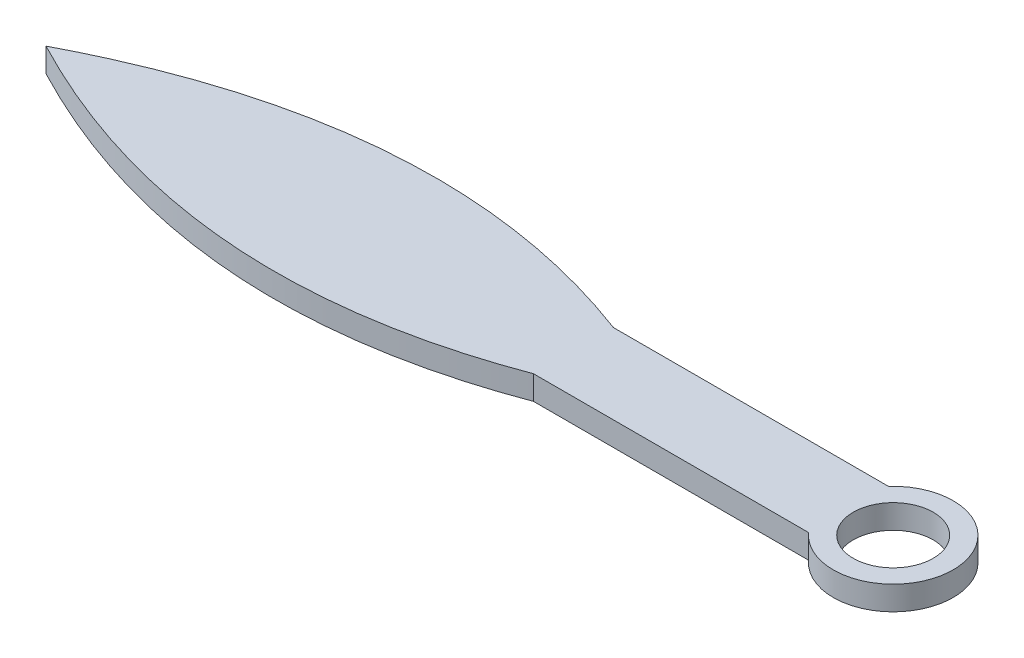
ISO-10303-21;
HEADER;
FILE_DESCRIPTION(('STEP AP214'),'2;1');
FILE_NAME('part.step','',(''),(''),'','','');
FILE_SCHEMA(('AUTOMOTIVE_DESIGN { 1 0 10303 214 1 1 1 1 }'));
ENDSEC;
DATA;
#1=APPLICATION_CONTEXT('core data for automotive mechanical design processes');
#2=APPLICATION_PROTOCOL_DEFINITION('international standard','automotive_design',2000,#1);
#3=PRODUCT_CONTEXT('',#1,'mechanical');
#4=PRODUCT('Part','Part','',(#3));
#5=PRODUCT_RELATED_PRODUCT_CATEGORY('part','',(#4));
#6=PRODUCT_DEFINITION_FORMATION('','',#4);
#7=PRODUCT_DEFINITION_CONTEXT('part definition',#1,'design');
#8=PRODUCT_DEFINITION('design','',#6,#7);
#9=PRODUCT_DEFINITION_SHAPE('','',#8);
#10=(LENGTH_UNIT() NAMED_UNIT(*) SI_UNIT(.MILLI.,.METRE.));
#11=(NAMED_UNIT(*) PLANE_ANGLE_UNIT() SI_UNIT($,.RADIAN.));
#12=(NAMED_UNIT(*) SI_UNIT($,.STERADIAN.) SOLID_ANGLE_UNIT());
#13=UNCERTAINTY_MEASURE_WITH_UNIT(LENGTH_MEASURE(1.E-05),#10,'distance_accuracy_value','');
#14=(GEOMETRIC_REPRESENTATION_CONTEXT(3) GLOBAL_UNCERTAINTY_ASSIGNED_CONTEXT((#13)) GLOBAL_UNIT_ASSIGNED_CONTEXT((#10,
#11,#12)) REPRESENTATION_CONTEXT('',''));
#15=CARTESIAN_POINT('',(0.,0.,0.));
#16=DIRECTION('',(0.,0.,1.));
#17=DIRECTION('',(1.,0.,0.));
#18=AXIS2_PLACEMENT_3D('',#15,#16,#17);
#19=CARTESIAN_POINT('',(-185.137744303975,7.62,25.1823706182628));
#20=DIRECTION('',(0.,1.,0.));
#21=DIRECTION('',(0.,0.,1.));
#22=AXIS2_PLACEMENT_3D('',#19,#20,#21);
#23=PLANE('',#22);
#24=CARTESIAN_POINT('',(-269.184277242038,7.62,0.));
#25=CARTESIAN_POINT('',(-184.88334998693,7.62,44.0147412365257));
#26=CARTESIAN_POINT('',(-101.6,7.62,12.7));
#27=B_SPLINE_CURVE_WITH_KNOTS('',2,(#24,#25,#26),.UNSPECIFIED.,.F.,.F.,(3,3),(0.,1.),.UNSPECIFIED.);
#28=CARTESIAN_POINT('',(-269.184277242038,7.62,0.));
#29=VERTEX_POINT('',#28);
#30=CARTESIAN_POINT('',(-101.6,7.62,12.7));
#31=VERTEX_POINT('',#30);
#32=EDGE_CURVE('E169',#29,#31,#27,.T.);
#33=ORIENTED_EDGE('',*,*,#32,.T.);
#34=DIRECTION('',(1.,0.,0.));
#35=VECTOR('',#34,1.);
#36=CARTESIAN_POINT('',(-14.1990316571237,7.62,12.7));
#37=LINE('',#36,#35);
#38=CARTESIAN_POINT('',(-14.1990316571237,7.62,12.7));
#39=VERTEX_POINT('',#38);
#40=EDGE_CURVE('E92',#31,#39,#37,.T.);
#41=ORIENTED_EDGE('',*,*,#40,.T.);
#42=CARTESIAN_POINT('',(0.,7.62,0.));
#43=DIRECTION('',(0.,1.,0.));
#44=DIRECTION('',(0.,0.,1.));
#45=AXIS2_PLACEMENT_3D('',#42,#43,#44);
#46=CIRCLE('',#45,19.05);
#47=CARTESIAN_POINT('',(-14.1990316571237,7.62,-12.7));
#48=VERTEX_POINT('',#47);
#49=EDGE_CURVE('E96',#39,#48,#46,.T.);
#50=ORIENTED_EDGE('',*,*,#49,.T.);
#51=DIRECTION('',(-1.,0.,0.));
#52=VECTOR('',#51,1.);
#53=CARTESIAN_POINT('',(-14.1990316571237,7.62,-12.7));
#54=LINE('',#53,#52);
#55=CARTESIAN_POINT('',(-101.6,7.62,-12.7));
#56=VERTEX_POINT('',#55);
#57=EDGE_CURVE('E100',#48,#56,#54,.T.);
#58=ORIENTED_EDGE('',*,*,#57,.T.);
#59=CARTESIAN_POINT('',(-101.6,7.62,-12.7));
#60=CARTESIAN_POINT('',(-184.88334998693,7.62,-44.0147412365256));
#61=CARTESIAN_POINT('',(-269.184277242038,7.62,0.));
#62=B_SPLINE_CURVE_WITH_KNOTS('',2,(#59,#60,#61),.UNSPECIFIED.,.F.,.F.,(3,3),(0.,1.),.UNSPECIFIED.);
#63=EDGE_CURVE('E58',#56,#29,#62,.T.);
#64=ORIENTED_EDGE('',*,*,#63,.T.);
#65=EDGE_LOOP('',(#33,#41,#50,#58,#64));
#66=FACE_BOUND('',#65,.T.);
#67=CARTESIAN_POINT('',(0.,7.62,0.));
#68=DIRECTION('',(0.,1.,0.));
#69=DIRECTION('',(0.,0.,1.));
#70=AXIS2_PLACEMENT_3D('',#67,#68,#69);
#71=CIRCLE('',#70,12.7);
#72=CARTESIAN_POINT('',(0.,7.62,-12.7));
#73=VERTEX_POINT('',#72);
#74=EDGE_CURVE('E160',#73,#73,#71,.T.);
#75=ORIENTED_EDGE('',*,*,#74,.F.);
#76=EDGE_LOOP('',(#75));
#77=FACE_BOUND('',#76,.T.);
#78=ADVANCED_FACE('F39',(#66,#77),#23,.T.);
#79=CARTESIAN_POINT('',(-185.137744303975,0.,25.1823706182628));
#80=DIRECTION('',(0.,1.,0.));
#81=DIRECTION('',(0.,0.,1.));
#82=AXIS2_PLACEMENT_3D('',#79,#80,#81);
#83=PLANE('',#82);
#84=CARTESIAN_POINT('',(-269.184277242038,0.,0.));
#85=CARTESIAN_POINT('',(-184.88334998693,0.,44.0147412365257));
#86=CARTESIAN_POINT('',(-101.6,0.,12.7));
#87=B_SPLINE_CURVE_WITH_KNOTS('',2,(#84,#85,#86),.UNSPECIFIED.,.F.,.F.,(3,3),(0.,1.),.UNSPECIFIED.);
#88=CARTESIAN_POINT('',(-269.184277242038,0.,0.));
#89=VERTEX_POINT('',#88);
#90=CARTESIAN_POINT('',(-101.6,0.,12.7));
#91=VERTEX_POINT('',#90);
#92=EDGE_CURVE('E123',#89,#91,#87,.T.);
#93=ORIENTED_EDGE('',*,*,#92,.F.);
#94=CARTESIAN_POINT('',(-101.6,0.,-12.7));
#95=CARTESIAN_POINT('',(-184.88334998693,0.,-44.0147412365256));
#96=CARTESIAN_POINT('',(-269.184277242038,0.,0.));
#97=B_SPLINE_CURVE_WITH_KNOTS('',2,(#94,#95,#96),.UNSPECIFIED.,.F.,.F.,(3,3),(0.,1.),.UNSPECIFIED.);
#98=CARTESIAN_POINT('',(-101.6,0.,-12.7));
#99=VERTEX_POINT('',#98);
#100=EDGE_CURVE('E84',#99,#89,#97,.T.);
#101=ORIENTED_EDGE('',*,*,#100,.F.);
#102=DIRECTION('',(-1.,0.,0.));
#103=VECTOR('',#102,1.);
#104=CARTESIAN_POINT('',(-14.1990316571237,0.,-12.7));
#105=LINE('',#104,#103);
#106=CARTESIAN_POINT('',(-14.1990316571237,0.,-12.7));
#107=VERTEX_POINT('',#106);
#108=EDGE_CURVE('E78',#107,#99,#105,.T.);
#109=ORIENTED_EDGE('',*,*,#108,.F.);
#110=CARTESIAN_POINT('',(0.,0.,0.));
#111=DIRECTION('',(0.,1.,0.));
#112=DIRECTION('',(0.,0.,1.));
#113=AXIS2_PLACEMENT_3D('',#110,#111,#112);
#114=CIRCLE('',#113,19.05);
#115=CARTESIAN_POINT('',(-14.1990316571237,0.,12.7));
#116=VERTEX_POINT('',#115);
#117=EDGE_CURVE('E108',#116,#107,#114,.T.);
#118=ORIENTED_EDGE('',*,*,#117,.F.);
#119=DIRECTION('',(1.,0.,0.));
#120=VECTOR('',#119,1.);
#121=CARTESIAN_POINT('',(-14.1990316571237,0.,12.7));
#122=LINE('',#121,#120);
#123=EDGE_CURVE('E184',#91,#116,#122,.T.);
#124=ORIENTED_EDGE('',*,*,#123,.F.);
#125=EDGE_LOOP('',(#93,#101,#109,#118,#124));
#126=FACE_BOUND('',#125,.T.);
#127=CARTESIAN_POINT('',(0.,0.,0.));
#128=DIRECTION('',(0.,1.,0.));
#129=DIRECTION('',(0.,0.,1.));
#130=AXIS2_PLACEMENT_3D('',#127,#128,#129);
#131=CIRCLE('',#130,12.7);
#132=CARTESIAN_POINT('',(0.,0.,-12.7));
#133=VERTEX_POINT('',#132);
#134=EDGE_CURVE('E163',#133,#133,#131,.T.);
#135=ORIENTED_EDGE('',*,*,#134,.T.);
#136=EDGE_LOOP('',(#135));
#137=FACE_BOUND('',#136,.T.);
#138=ADVANCED_FACE('F136',(#126,#137),#83,.F.);
#139=DIRECTION('',(0.,-1.,0.));
#140=VECTOR('',#139,1.);
#141=SURFACE_OF_LINEAR_EXTRUSION('',#27,#140);
#142=ORIENTED_EDGE('',*,*,#92,.T.);
#143=DIRECTION('',(0.,-1.,0.));
#144=VECTOR('',#143,1.);
#145=CARTESIAN_POINT('',(-101.6,7.62,12.7));
#146=LINE('',#145,#144);
#147=EDGE_CURVE('E11',#31,#91,#146,.T.);
#148=ORIENTED_EDGE('',*,*,#147,.F.);
#149=ORIENTED_EDGE('',*,*,#32,.F.);
#150=DIRECTION('',(0.,-1.,0.));
#151=VECTOR('',#150,1.);
#152=CARTESIAN_POINT('',(-269.184277242038,7.62,0.));
#153=LINE('',#152,#151);
#154=EDGE_CURVE('E116',#29,#89,#153,.T.);
#155=ORIENTED_EDGE('',*,*,#154,.T.);
#156=EDGE_LOOP('',(#142,#148,#149,#155));
#157=FACE_BOUND('',#156,.T.);
#158=ADVANCED_FACE('F41',(#157),#141,.F.);
#159=CARTESIAN_POINT('',(-14.1990316571237,7.62,12.7));
#160=DIRECTION('',(0.,0.,-1.));
#161=DIRECTION('',(-1.,0.,0.));
#162=AXIS2_PLACEMENT_3D('',#159,#160,#161);
#163=PLANE('',#162);
#164=ORIENTED_EDGE('',*,*,#123,.T.);
#165=DIRECTION('',(0.,-1.,0.));
#166=VECTOR('',#165,1.);
#167=CARTESIAN_POINT('',(-14.1990316571237,7.62,12.7));
#168=LINE('',#167,#166);
#169=EDGE_CURVE('E50',#39,#116,#168,.T.);
#170=ORIENTED_EDGE('',*,*,#169,.F.);
#171=ORIENTED_EDGE('',*,*,#40,.F.);
#172=ORIENTED_EDGE('',*,*,#147,.T.);
#173=EDGE_LOOP('',(#164,#170,#171,#172));
#174=FACE_BOUND('',#173,.T.);
#175=ADVANCED_FACE('F141',(#174),#163,.F.);
#176=CARTESIAN_POINT('',(0.,7.62,0.));
#177=DIRECTION('',(0.,-1.,0.));
#178=DIRECTION('',(0.,0.,-1.));
#179=AXIS2_PLACEMENT_3D('',#176,#177,#178);
#180=CYLINDRICAL_SURFACE('',#179,19.05);
#181=ORIENTED_EDGE('',*,*,#117,.T.);
#182=DIRECTION('',(0.,-1.,0.));
#183=VECTOR('',#182,1.);
#184=CARTESIAN_POINT('',(-14.1990316571237,7.62,-12.7));
#185=LINE('',#184,#183);
#186=EDGE_CURVE('E105',#48,#107,#185,.T.);
#187=ORIENTED_EDGE('',*,*,#186,.F.);
#188=ORIENTED_EDGE('',*,*,#49,.F.);
#189=ORIENTED_EDGE('',*,*,#169,.T.);
#190=EDGE_LOOP('',(#181,#187,#188,#189));
#191=FACE_BOUND('',#190,.T.);
#192=ADVANCED_FACE('F106',(#191),#180,.T.);
#193=CARTESIAN_POINT('',(-14.1990316571237,7.62,-12.7));
#194=DIRECTION('',(0.,0.,1.));
#195=DIRECTION('',(1.,0.,0.));
#196=AXIS2_PLACEMENT_3D('',#193,#194,#195);
#197=PLANE('',#196);
#198=ORIENTED_EDGE('',*,*,#108,.T.);
#199=DIRECTION('',(0.,-1.,0.));
#200=VECTOR('',#199,1.);
#201=CARTESIAN_POINT('',(-101.6,7.62,-12.7));
#202=LINE('',#201,#200);
#203=EDGE_CURVE('E110',#56,#99,#202,.T.);
#204=ORIENTED_EDGE('',*,*,#203,.F.);
#205=ORIENTED_EDGE('',*,*,#57,.F.);
#206=ORIENTED_EDGE('',*,*,#186,.T.);
#207=EDGE_LOOP('',(#198,#204,#205,#206));
#208=FACE_BOUND('',#207,.T.);
#209=ADVANCED_FACE('F112',(#208),#197,.F.);
#210=DIRECTION('',(0.,-1.,0.));
#211=VECTOR('',#210,1.);
#212=SURFACE_OF_LINEAR_EXTRUSION('',#62,#211);
#213=ORIENTED_EDGE('',*,*,#100,.T.);
#214=ORIENTED_EDGE('',*,*,#154,.F.);
#215=ORIENTED_EDGE('',*,*,#63,.F.);
#216=ORIENTED_EDGE('',*,*,#203,.T.);
#217=EDGE_LOOP('',(#213,#214,#215,#216));
#218=FACE_BOUND('',#217,.T.);
#219=ADVANCED_FACE('F131',(#218),#212,.F.);
#220=CARTESIAN_POINT('',(0.,7.62,0.));
#221=DIRECTION('',(0.,-1.,0.));
#222=DIRECTION('',(0.,0.,-1.));
#223=AXIS2_PLACEMENT_3D('',#220,#221,#222);
#224=CYLINDRICAL_SURFACE('',#223,12.7);
#225=CARTESIAN_POINT('',(0.,7.62,-12.7));
#226=CARTESIAN_POINT('',(0.,7.540625,-12.7));
#227=CARTESIAN_POINT('',(0.,7.46125,-12.7));
#228=CARTESIAN_POINT('',(0.,7.3025,-12.7));
#229=CARTESIAN_POINT('',(0.,7.223125,-12.7));
#230=CARTESIAN_POINT('',(0.,7.064375,-12.7));
#231=CARTESIAN_POINT('',(0.,6.985,-12.7));
#232=CARTESIAN_POINT('',(0.,6.82625,-12.7));
#233=CARTESIAN_POINT('',(0.,6.746875,-12.7));
#234=CARTESIAN_POINT('',(0.,6.588125,-12.7));
#235=CARTESIAN_POINT('',(0.,6.50875,-12.7));
#236=CARTESIAN_POINT('',(0.,6.35,-12.7));
#237=CARTESIAN_POINT('',(0.,6.270625,-12.7));
#238=CARTESIAN_POINT('',(0.,6.111875,-12.7));
#239=CARTESIAN_POINT('',(0.,6.0325,-12.7));
#240=CARTESIAN_POINT('',(0.,5.87375,-12.7));
#241=CARTESIAN_POINT('',(0.,5.794375,-12.7));
#242=CARTESIAN_POINT('',(0.,5.635625,-12.7));
#243=CARTESIAN_POINT('',(0.,5.55625,-12.7));
#244=CARTESIAN_POINT('',(0.,5.3975,-12.7));
#245=CARTESIAN_POINT('',(0.,5.318125,-12.7));
#246=CARTESIAN_POINT('',(0.,5.159375,-12.7));
#247=CARTESIAN_POINT('',(0.,5.08,-12.7));
#248=CARTESIAN_POINT('',(0.,4.92125,-12.7));
#249=CARTESIAN_POINT('',(0.,4.841875,-12.7));
#250=CARTESIAN_POINT('',(0.,4.683125,-12.7));
#251=CARTESIAN_POINT('',(0.,4.60375,-12.7));
#252=CARTESIAN_POINT('',(0.,4.445,-12.7));
#253=CARTESIAN_POINT('',(0.,4.365625,-12.7));
#254=CARTESIAN_POINT('',(0.,4.206875,-12.7));
#255=CARTESIAN_POINT('',(0.,4.1275,-12.7));
#256=CARTESIAN_POINT('',(0.,3.96875,-12.7));
#257=CARTESIAN_POINT('',(0.,3.889375,-12.7));
#258=CARTESIAN_POINT('',(0.,3.730625,-12.7));
#259=CARTESIAN_POINT('',(0.,3.65125,-12.7));
#260=CARTESIAN_POINT('',(0.,3.4925,-12.7));
#261=CARTESIAN_POINT('',(0.,3.413125,-12.7));
#262=CARTESIAN_POINT('',(0.,3.254375,-12.7));
#263=CARTESIAN_POINT('',(0.,3.175,-12.7));
#264=CARTESIAN_POINT('',(0.,3.01625,-12.7));
#265=CARTESIAN_POINT('',(0.,2.936875,-12.7));
#266=CARTESIAN_POINT('',(0.,2.778125,-12.7));
#267=CARTESIAN_POINT('',(0.,2.69875,-12.7));
#268=CARTESIAN_POINT('',(0.,2.54,-12.7));
#269=CARTESIAN_POINT('',(0.,2.460625,-12.7));
#270=CARTESIAN_POINT('',(0.,2.301875,-12.7));
#271=CARTESIAN_POINT('',(0.,2.2225,-12.7));
#272=CARTESIAN_POINT('',(0.,2.06375,-12.7));
#273=CARTESIAN_POINT('',(0.,1.984375,-12.7));
#274=CARTESIAN_POINT('',(0.,1.825625,-12.7));
#275=CARTESIAN_POINT('',(0.,1.74625,-12.7));
#276=CARTESIAN_POINT('',(0.,1.5875,-12.7));
#277=CARTESIAN_POINT('',(0.,1.508125,-12.7));
#278=CARTESIAN_POINT('',(0.,1.349375,-12.7));
#279=CARTESIAN_POINT('',(0.,1.27,-12.7));
#280=CARTESIAN_POINT('',(0.,1.11125,-12.7));
#281=CARTESIAN_POINT('',(0.,1.031875,-12.7));
#282=CARTESIAN_POINT('',(0.,0.873125,-12.7));
#283=CARTESIAN_POINT('',(0.,0.79375,-12.7));
#284=CARTESIAN_POINT('',(0.,0.635,-12.7));
#285=CARTESIAN_POINT('',(0.,0.555625,-12.7));
#286=CARTESIAN_POINT('',(0.,0.396875,-12.7));
#287=CARTESIAN_POINT('',(0.,0.3175,-12.7));
#288=CARTESIAN_POINT('',(0.,0.15875,-12.7));
#289=CARTESIAN_POINT('',(0.,0.0793750000000001,-12.7));
#290=CARTESIAN_POINT('',(0.,0.,-12.7));
#291=B_SPLINE_CURVE_WITH_KNOTS('',3,(#225,#226,#227,#228,#229,#230,#231,#232,#233,#234,#235,
#236,#237,#238,#239,#240,#241,#242,#243,#244,#245,#246,#247,#248,#249,#250,#251,#252,#253,#254,
#255,#256,#257,#258,#259,#260,#261,#262,#263,#264,#265,#266,#267,#268,#269,#270,#271,#272,#273,
#274,#275,#276,#277,#278,#279,#280,#281,#282,#283,#284,#285,#286,#287,#288,#289,#290),
.UNSPECIFIED.,.F.,.F.,(4,2,2,2,2,2,2,2,2,2,2,2,2,2,2,2,2,2,2,2,2,2,2,2,2,2,2,2,2,2,2,2,4),(0.,
0.238125,0.47625,0.714375000000001,0.9525,1.190625,1.42875,1.666875,1.905,2.143125,2.38125,
2.619375,2.8575,3.095625,3.33375,3.571875,3.81,4.048125,4.28625,4.524375,4.7625,5.000625,
5.23875,5.476875,5.715,5.953125,6.19125,6.429375,6.6675,6.905625,7.14375,7.381875,7.62),.UNSPECIFIED.);
#292=EDGE_CURVE('BSEAM135',#73,#133,#291,.T.);
#293=ORIENTED_EDGE('',*,*,#74,.T.);
#294=ORIENTED_EDGE('',*,*,#134,.F.);
#295=ORIENTED_EDGE('',*,*,#292,.T.);
#296=ORIENTED_EDGE('',*,*,#292,.F.);
#297=EDGE_LOOP('',(#293,#295,#294,#296));
#298=FACE_BOUND('',#297,.T.);
#299=ADVANCED_FACE('F135',(#298),#224,.F.);
#300=CLOSED_SHELL('',(#78,#138,#158,#175,#192,#209,#219,#299));
#301=MANIFOLD_SOLID_BREP('B2',#300);
#302=ADVANCED_BREP_SHAPE_REPRESENTATION('',(#18,#301),#14);
#303=SHAPE_DEFINITION_REPRESENTATION(#9,#302);
ENDSEC;
END-ISO-10303-21;
